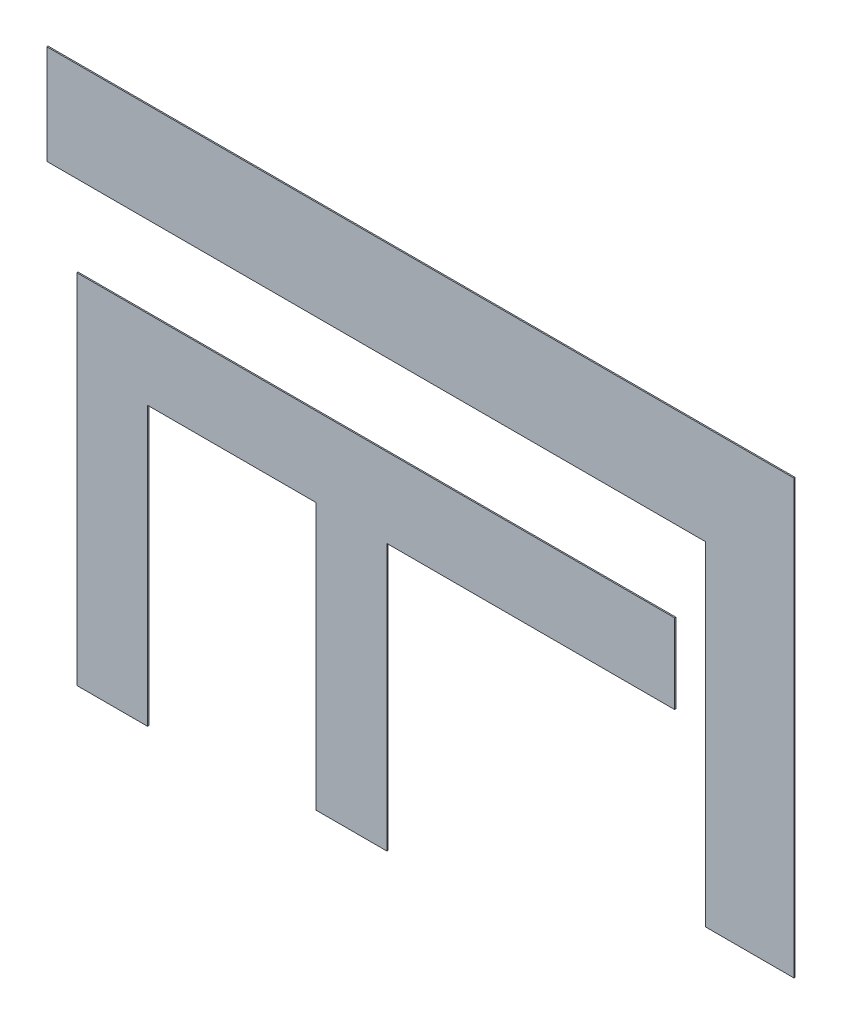
ISO-10303-21;
HEADER;
FILE_DESCRIPTION(('STEP AP214'),'2;1');
FILE_NAME('part.step','',(''),(''),'','','');
FILE_SCHEMA(('AUTOMOTIVE_DESIGN { 1 0 10303 214 1 1 1 1 }'));
ENDSEC;
DATA;
#1=APPLICATION_CONTEXT('core data for automotive mechanical design processes');
#2=APPLICATION_PROTOCOL_DEFINITION('international standard','automotive_design',2000,#1);
#3=PRODUCT_CONTEXT('',#1,'mechanical');
#4=PRODUCT('Part','Part','',(#3));
#5=PRODUCT_RELATED_PRODUCT_CATEGORY('part','',(#4));
#6=PRODUCT_DEFINITION_FORMATION('','',#4);
#7=PRODUCT_DEFINITION_CONTEXT('part definition',#1,'design');
#8=PRODUCT_DEFINITION('design','',#6,#7);
#9=PRODUCT_DEFINITION_SHAPE('','',#8);
#10=(LENGTH_UNIT() NAMED_UNIT(*) SI_UNIT(.MILLI.,.METRE.));
#11=(NAMED_UNIT(*) PLANE_ANGLE_UNIT() SI_UNIT($,.RADIAN.));
#12=(NAMED_UNIT(*) SI_UNIT($,.STERADIAN.) SOLID_ANGLE_UNIT());
#13=UNCERTAINTY_MEASURE_WITH_UNIT(LENGTH_MEASURE(1.E-05),#10,'distance_accuracy_value','');
#14=(GEOMETRIC_REPRESENTATION_CONTEXT(3) GLOBAL_UNCERTAINTY_ASSIGNED_CONTEXT((#13)) GLOBAL_UNIT_ASSIGNED_CONTEXT((#10,
#11,#12)) REPRESENTATION_CONTEXT('',''));
#15=CARTESIAN_POINT('',(0.,0.,0.));
#16=DIRECTION('',(0.,0.,1.));
#17=DIRECTION('',(1.,0.,0.));
#18=AXIS2_PLACEMENT_3D('',#15,#16,#17);
#19=CARTESIAN_POINT('',(91.640955765495,27.206571076401,-3.605521934089));
#20=DIRECTION('',(0.,-8.74227765734797E-08,0.999999999999996));
#21=DIRECTION('',(0.,-0.999999999999996,-8.74227765734797E-08));
#22=AXIS2_PLACEMENT_3D('',#19,#20,#21);
#23=PLANE('',#22);
#24=DIRECTION('',(-4.371138828674E-08,-0.999999999999999,0.));
#25=VECTOR('',#24,1.);
#26=CARTESIAN_POINT('',(91.954357595895,26.701409513994,-3.605521978252));
#27=LINE('',#26,#25);
#28=CARTESIAN_POINT('',(91.954357595895,26.7014095140236,-3.605521978252));
#29=VERTEX_POINT('',#28);
#30=CARTESIAN_POINT('',(91.954357619691,27.2458011060656,-3.605521954456));
#31=VERTEX_POINT('',#30);
#32=EDGE_CURVE('P0_E89',#29,#31,#27,.F.);
#33=ORIENTED_EDGE('',*,*,#32,.F.);
#34=DIRECTION('',(0.999999999999999,-4.37113882867396E-08,0.));
#35=VECTOR('',#34,1.);
#36=CARTESIAN_POINT('',(92.098606547719,26.7014095076016,-3.605521978252));
#37=LINE('',#36,#35);
#38=CARTESIAN_POINT('',(92.0986065477191,26.7014095076017,-3.605521957666));
#39=VERTEX_POINT('',#38);
#40=EDGE_CURVE('P0_E74',#39,#29,#37,.F.);
#41=ORIENTED_EDGE('',*,*,#40,.F.);
#42=DIRECTION('',(4.371138828674E-08,0.999999999999999,0.));
#43=VECTOR('',#42,1.);
#44=CARTESIAN_POINT('',(92.098606578598,27.40783416902,-3.605521916494));
#45=LINE('',#44,#43);
#46=CARTESIAN_POINT('',(92.098606578598,27.4078341689327,-3.605521916494));
#47=VERTEX_POINT('',#46);
#48=EDGE_CURVE('P0_E79',#47,#39,#45,.F.);
#49=ORIENTED_EDGE('',*,*,#48,.F.);
#50=DIRECTION('',(0.999999999999999,-4.37113882867396E-08,0.));
#51=VECTOR('',#50,1.);
#52=CARTESIAN_POINT('',(90.879406533728,27.4078342222256,-3.605521916494));
#53=LINE('',#52,#51);
#54=CARTESIAN_POINT('',(90.8794065337279,27.4078342222256,-3.605521923577));
#55=VERTEX_POINT('',#54);
#56=EDGE_CURVE('P0_E107',#55,#47,#53,.T.);
#57=ORIENTED_EDGE('',*,*,#56,.F.);
#58=DIRECTION('',(-4.371138828674E-08,-0.999999999999999,0.));
#59=VECTOR('',#58,1.);
#60=CARTESIAN_POINT('',(90.879406526645,27.245801153141,-3.60552193066));
#61=LINE('',#60,#59);
#62=CARTESIAN_POINT('',(90.879406526645,27.2458011531406,-3.60552193066));
#63=VERTEX_POINT('',#62);
#64=EDGE_CURVE('P0_E108',#63,#55,#61,.F.);
#65=ORIENTED_EDGE('',*,*,#64,.F.);
#66=DIRECTION('',(0.999999999999999,-4.37113882867396E-08,0.));
#67=VECTOR('',#66,1.);
#68=CARTESIAN_POINT('',(91.954357619691,27.2458011060656,-3.60552193066));
#69=LINE('',#68,#67);
#70=EDGE_CURVE('P0_E111',#31,#63,#69,.F.);
#71=ORIENTED_EDGE('',*,*,#70,.F.);
#72=EDGE_LOOP('',(#33,#41,#49,#57,#65,#71));
#73=FACE_BOUND('',#72,.T.);
#74=ADVANCED_FACE('P0_F17',(#73),#23,.T.);
#75=CARTESIAN_POINT('',(92.098606578598,27.40783416902,-3.606521916494));
#76=DIRECTION('',(0.999999999999999,-4.371138828674E-08,0.));
#77=DIRECTION('',(4.371138828674E-08,0.999999999999999,0.));
#78=AXIS2_PLACEMENT_3D('',#75,#76,#77);
#79=PLANE('',#78);
#80=DIRECTION('',(0.,-8.74227765734797E-08,0.999999999999996));
#81=VECTOR('',#80,1.);
#82=CARTESIAN_POINT('',(92.098606578598,27.4078341690201,-3.606521916494));
#83=LINE('',#82,#81);
#84=CARTESIAN_POINT('',(92.098606578598,27.4078341957538,-3.60752191649402));
#85=VERTEX_POINT('',#84);
#86=EDGE_CURVE('P0_E83',#47,#85,#83,.F.);
#87=ORIENTED_EDGE('',*,*,#86,.F.);
#88=ORIENTED_EDGE('',*,*,#48,.T.);
#89=DIRECTION('',(0.,8.74227765734797E-08,-0.999999999999996));
#90=VECTOR('',#89,1.);
#91=CARTESIAN_POINT('',(92.098606547719,26.701409507689,-3.606521978252));
#92=LINE('',#91,#90);
#93=CARTESIAN_POINT('',(92.098606568305,26.7014095077768,-3.60752197825163));
#94=VERTEX_POINT('',#93);
#95=EDGE_CURVE('P0_E81',#94,#39,#92,.F.);
#96=ORIENTED_EDGE('',*,*,#95,.F.);
#97=DIRECTION('',(0.,0.999999999999996,8.74227765734797E-08));
#98=VECTOR('',#97,1.);
#99=CARTESIAN_POINT('',(92.098606578598,27.206571076576,-3.607521934089));
#100=LINE('',#99,#98);
#101=EDGE_CURVE('P0_E129',#85,#94,#100,.F.);
#102=ORIENTED_EDGE('',*,*,#101,.F.);
#103=EDGE_LOOP('',(#87,#88,#96,#102));
#104=FACE_BOUND('',#103,.T.);
#105=ADVANCED_FACE('P0_F80',(#104),#79,.T.);
#106=CARTESIAN_POINT('',(92.098606547719,26.701409507689,-3.606521978252));
#107=DIRECTION('',(-4.37113882867398E-08,-0.999999999999995,-8.74227765734796E-08));
#108=DIRECTION('',(0.,8.74227765734797E-08,-0.999999999999996));
#109=AXIS2_PLACEMENT_3D('',#106,#107,#108);
#110=PLANE('',#109);
#111=ORIENTED_EDGE('',*,*,#95,.T.);
#112=ORIENTED_EDGE('',*,*,#40,.T.);
#113=DIRECTION('',(0.,0.,1.));
#114=VECTOR('',#113,1.);
#115=CARTESIAN_POINT('',(91.954357595895,26.701409514082,-3.606521978252));
#116=LINE('',#115,#114);
#117=CARTESIAN_POINT('',(91.954357595895,26.7014095098787,-3.60752197825163));
#118=VERTEX_POINT('',#117);
#119=EDGE_CURVE('P0_E68',#118,#29,#116,.T.);
#120=ORIENTED_EDGE('',*,*,#119,.F.);
#121=DIRECTION('',(1.,0.,0.));
#122=VECTOR('',#121,1.);
#123=CARTESIAN_POINT('',(91.640955765495,26.701409507777,-3.60752197825163));
#124=LINE('',#123,#122);
#125=EDGE_CURVE('P0_E93',#94,#118,#124,.F.);
#126=ORIENTED_EDGE('',*,*,#125,.F.);
#127=EDGE_LOOP('',(#111,#112,#120,#126));
#128=FACE_BOUND('',#127,.T.);
#129=ADVANCED_FACE('P0_F91',(#128),#110,.T.);
#130=CARTESIAN_POINT('',(91.954357595895,26.701409513994,-3.606521978252));
#131=DIRECTION('',(-0.999999999999999,4.371138828674E-08,0.));
#132=DIRECTION('',(-4.371138828674E-08,-0.999999999999999,0.));
#133=AXIS2_PLACEMENT_3D('',#130,#131,#132);
#134=PLANE('',#133);
#135=ORIENTED_EDGE('',*,*,#119,.T.);
#136=ORIENTED_EDGE('',*,*,#32,.T.);
#137=DIRECTION('',(0.,8.74227765734797E-08,-0.999999999999996));
#138=VECTOR('',#137,1.);
#139=CARTESIAN_POINT('',(91.954357619691,27.245801106153,-3.60652193066));
#140=LINE('',#139,#138);
#141=CARTESIAN_POINT('',(91.954357607793,27.2458011062401,-3.6075219306594));
#142=VERTEX_POINT('',#141);
#143=EDGE_CURVE('P0_E20',#142,#31,#140,.F.);
#144=ORIENTED_EDGE('',*,*,#143,.F.);
#145=DIRECTION('',(0.,0.999999999999996,8.74227765734797E-08));
#146=VECTOR('',#145,1.);
#147=CARTESIAN_POINT('',(91.954357595895,27.206571076576,-3.607521934089));
#148=LINE('',#147,#146);
#149=EDGE_CURVE('P0_E119',#118,#142,#148,.T.);
#150=ORIENTED_EDGE('',*,*,#149,.F.);
#151=EDGE_LOOP('',(#135,#136,#144,#150));
#152=FACE_BOUND('',#151,.T.);
#153=ADVANCED_FACE('P0_F151',(#152),#134,.T.);
#154=CARTESIAN_POINT('',(91.954357619691,27.245801106153,-3.60652193066));
#155=DIRECTION('',(-4.37113882867398E-08,-0.999999999999995,-8.74227765734796E-08));
#156=DIRECTION('',(0.,8.74227765734797E-08,-0.999999999999996));
#157=AXIS2_PLACEMENT_3D('',#154,#155,#156);
#158=PLANE('',#157);
#159=ORIENTED_EDGE('',*,*,#143,.T.);
#160=ORIENTED_EDGE('',*,*,#70,.T.);
#161=DIRECTION('',(0.,0.,1.));
#162=VECTOR('',#161,1.);
#163=CARTESIAN_POINT('',(90.879406526645,27.245801153228,-3.60652193066));
#164=LINE('',#163,#162);
#165=CARTESIAN_POINT('',(90.879406526645,27.245801129734,-3.6075219306594));
#166=VERTEX_POINT('',#165);
#167=EDGE_CURVE('P0_E109',#166,#63,#164,.T.);
#168=ORIENTED_EDGE('',*,*,#167,.F.);
#169=DIRECTION('',(1.,0.,0.));
#170=VECTOR('',#169,1.);
#171=CARTESIAN_POINT('',(91.640955765495,27.24580110624,-3.6075219306594));
#172=LINE('',#171,#170);
#173=EDGE_CURVE('P0_E118',#142,#166,#172,.F.);
#174=ORIENTED_EDGE('',*,*,#173,.F.);
#175=EDGE_LOOP('',(#159,#160,#168,#174));
#176=FACE_BOUND('',#175,.T.);
#177=ADVANCED_FACE('P0_F139',(#176),#158,.T.);
#178=CARTESIAN_POINT('',(90.879406526645,27.245801153141,-3.60652193066));
#179=DIRECTION('',(-0.999999999999999,4.371138828674E-08,0.));
#180=DIRECTION('',(-4.371138828674E-08,-0.999999999999999,0.));
#181=AXIS2_PLACEMENT_3D('',#178,#179,#180);
#182=PLANE('',#181);
#183=ORIENTED_EDGE('',*,*,#167,.T.);
#184=ORIENTED_EDGE('',*,*,#64,.T.);
#185=DIRECTION('',(0.,-8.74227765734797E-08,0.999999999999996));
#186=VECTOR('',#185,1.);
#187=CARTESIAN_POINT('',(90.879406533728,27.407834222313,-3.606521916494));
#188=LINE('',#187,#186);
#189=CARTESIAN_POINT('',(90.8794065301865,27.4078342224001,-3.60752191649402));
#190=VERTEX_POINT('',#189);
#191=EDGE_CURVE('P0_E35',#190,#55,#188,.T.);
#192=ORIENTED_EDGE('',*,*,#191,.F.);
#193=DIRECTION('',(0.,0.999999999999996,8.74227765734797E-08));
#194=VECTOR('',#193,1.);
#195=CARTESIAN_POINT('',(90.879406526645,27.206571076576,-3.607521934089));
#196=LINE('',#195,#194);
#197=EDGE_CURVE('P0_E26',#166,#190,#196,.T.);
#198=ORIENTED_EDGE('',*,*,#197,.F.);
#199=EDGE_LOOP('',(#183,#184,#192,#198));
#200=FACE_BOUND('',#199,.T.);
#201=ADVANCED_FACE('P0_F140',(#200),#182,.T.);
#202=CARTESIAN_POINT('',(90.879406533728,27.407834222313,-3.606521916494));
#203=DIRECTION('',(4.37113882867398E-08,0.999999999999995,8.74227765734796E-08));
#204=DIRECTION('',(0.,-8.74227765734797E-08,0.999999999999996));
#205=AXIS2_PLACEMENT_3D('',#202,#203,#204);
#206=PLANE('',#205);
#207=ORIENTED_EDGE('',*,*,#191,.T.);
#208=ORIENTED_EDGE('',*,*,#56,.T.);
#209=ORIENTED_EDGE('',*,*,#86,.T.);
#210=DIRECTION('',(1.,0.,0.));
#211=VECTOR('',#210,1.);
#212=CARTESIAN_POINT('',(91.640955765495,27.4078342224,-3.60752191649402));
#213=LINE('',#212,#211);
#214=EDGE_CURVE('P0_E11',#190,#85,#213,.T.);
#215=ORIENTED_EDGE('',*,*,#214,.F.);
#216=EDGE_LOOP('',(#207,#208,#209,#215));
#217=FACE_BOUND('',#216,.T.);
#218=ADVANCED_FACE('P0_F142',(#217),#206,.T.);
#219=CARTESIAN_POINT('',(91.640955765495,27.206571076576,-3.607521934089));
#220=DIRECTION('',(0.,8.74227765734797E-08,-0.999999999999996));
#221=DIRECTION('',(0.,0.999999999999996,8.74227765734797E-08));
#222=AXIS2_PLACEMENT_3D('',#219,#220,#221);
#223=PLANE('',#222);
#224=ORIENTED_EDGE('',*,*,#197,.T.);
#225=ORIENTED_EDGE('',*,*,#214,.T.);
#226=ORIENTED_EDGE('',*,*,#101,.T.);
#227=ORIENTED_EDGE('',*,*,#125,.T.);
#228=ORIENTED_EDGE('',*,*,#149,.T.);
#229=ORIENTED_EDGE('',*,*,#173,.T.);
#230=EDGE_LOOP('',(#224,#225,#226,#227,#228,#229));
#231=FACE_BOUND('',#230,.T.);
#232=ADVANCED_FACE('P0_F138',(#231),#223,.T.);
#233=CLOSED_SHELL('',(#74,#105,#129,#153,#177,#201,#218,#232));
#234=MANIFOLD_SOLID_BREP('P0_B1',#233);
#235=CARTESIAN_POINT('',(91.309690301692,26.894536980158,-3.605521961368));
#236=DIRECTION('',(0.,-8.74227765734797E-08,0.999999999999996));
#237=DIRECTION('',(0.,-0.999999999999996,-8.74227765734797E-08));
#238=AXIS2_PLACEMENT_3D('',#235,#236,#237);
#239=PLANE('',#238);
#240=DIRECTION('',(-4.371138828674E-08,-0.999999999999999,0.));
#241=VECTOR('',#240,1.);
#242=CARTESIAN_POINT('',(90.928491195511,26.529664381666,-3.605521993266));
#243=LINE('',#242,#241);
#244=CARTESIAN_POINT('',(90.928491195511,26.5296643816664,-3.605521993266));
#245=VERTEX_POINT('',#244);
#246=CARTESIAN_POINT('',(90.9284912210089,27.1129834395114,-3.60552195926933));
#247=VERTEX_POINT('',#246);
#248=EDGE_CURVE('P1_E158',#245,#247,#243,.F.);
#249=ORIENTED_EDGE('',*,*,#248,.F.);
#250=DIRECTION('',(0.999999999999999,-4.37113882867396E-08,0.));
#251=VECTOR('',#250,1.);
#252=CARTESIAN_POINT('',(91.043890358734,26.5296643765346,-3.605521993266));
#253=LINE('',#252,#251);
#254=CARTESIAN_POINT('',(91.0438903587339,26.5296643765346,-3.6055219734345));
#255=VERTEX_POINT('',#254);
#256=EDGE_CURVE('P1_E94',#255,#245,#253,.F.);
#257=ORIENTED_EDGE('',*,*,#256,.F.);
#258=DIRECTION('',(4.371138828674E-08,0.999999999999999,0.));
#259=VECTOR('',#258,1.);
#260=CARTESIAN_POINT('',(91.043890378565,26.983356977236,-3.605521953603));
#261=LINE('',#260,#259);
#262=CARTESIAN_POINT('',(91.043890378565,26.9833569771489,-3.605521953603));
#263=VERTEX_POINT('',#262);
#264=EDGE_CURVE('P1_E91',#263,#255,#261,.F.);
#265=ORIENTED_EDGE('',*,*,#264,.F.);
#266=DIRECTION('',(0.999999999999999,-4.37113882867396E-08,0.));
#267=VECTOR('',#266,1.);
#268=CARTESIAN_POINT('',(91.318951397753,26.9833569651256,-3.605521953603));
#269=LINE('',#268,#267);
#270=CARTESIAN_POINT('',(91.3189513977528,26.9833569651256,-3.6055219726055));
#271=VERTEX_POINT('',#270);
#272=EDGE_CURVE('P1_E107',#271,#263,#269,.F.);
#273=ORIENTED_EDGE('',*,*,#272,.F.);
#274=DIRECTION('',(-4.371138828674E-08,-0.999999999999999,0.));
#275=VECTOR('',#274,1.);
#276=CARTESIAN_POINT('',(91.31895137875,26.54863409006,-3.605521991608));
#277=LINE('',#276,#275);
#278=CARTESIAN_POINT('',(91.31895137875,26.5486340900599,-3.605521991608));
#279=VERTEX_POINT('',#278);
#280=EDGE_CURVE('P1_E113',#279,#271,#277,.F.);
#281=ORIENTED_EDGE('',*,*,#280,.F.);
#282=DIRECTION('',(0.999999999999999,-4.37113882867396E-08,0.));
#283=VECTOR('',#282,1.);
#284=CARTESIAN_POINT('',(91.434350541973,26.5486340849286,-3.605521991608));
#285=LINE('',#284,#283);
#286=CARTESIAN_POINT('',(91.4343505419729,26.5486340849286,-3.6055219726055));
#287=VERTEX_POINT('',#286);
#288=EDGE_CURVE('P1_E121',#287,#279,#285,.F.);
#289=ORIENTED_EDGE('',*,*,#288,.F.);
#290=DIRECTION('',(4.371138828674E-08,0.999999999999999,0.));
#291=VECTOR('',#290,1.);
#292=CARTESIAN_POINT('',(91.434350560975,26.983356960169,-3.605521953603));
#293=LINE('',#292,#291);
#294=CARTESIAN_POINT('',(91.434350560975,26.9833569601686,-3.605521953603));
#295=VERTEX_POINT('',#294);
#296=EDGE_CURVE('P1_E127',#295,#287,#293,.F.);
#297=ORIENTED_EDGE('',*,*,#296,.F.);
#298=DIRECTION('',(0.999999999999999,-4.37113882867396E-08,0.));
#299=VECTOR('',#298,1.);
#300=CARTESIAN_POINT('',(91.90385126614,26.9833569395586,-3.605521953603));
#301=LINE('',#300,#299);
#302=CARTESIAN_POINT('',(91.90385126614,26.9833569395586,-3.605521947937));
#303=VERTEX_POINT('',#302);
#304=EDGE_CURVE('P1_E133',#303,#295,#301,.F.);
#305=ORIENTED_EDGE('',*,*,#304,.F.);
#306=DIRECTION('',(4.371138828674E-08,0.999999999999999,0.));
#307=VECTOR('',#306,1.);
#308=CARTESIAN_POINT('',(91.903851271806,27.112983396964,-3.605521942271));
#309=LINE('',#308,#307);
#310=CARTESIAN_POINT('',(91.903851271806,27.1129833969937,-3.605521942271));
#311=VERTEX_POINT('',#310);
#312=EDGE_CURVE('P1_E141',#311,#303,#309,.F.);
#313=ORIENTED_EDGE('',*,*,#312,.F.);
#314=DIRECTION('',(0.999999999999999,-4.37113882867396E-08,0.));
#315=VECTOR('',#314,1.);
#316=CARTESIAN_POINT('',(90.928491221009,27.1129834395116,-3.605521942271));
#317=LINE('',#316,#315);
#318=EDGE_CURVE('P1_E148',#247,#311,#317,.T.);
#319=ORIENTED_EDGE('',*,*,#318,.F.);
#320=EDGE_LOOP('',(#249,#257,#265,#273,#281,#289,#297,#305,#313,#319));
#321=FACE_BOUND('',#320,.T.);
#322=ADVANCED_FACE('P1_F17',(#321),#239,.T.);
#323=CARTESIAN_POINT('',(91.043890378565,26.983356977236,-3.606521953603));
#324=DIRECTION('',(0.999999999999999,-4.371138828674E-08,0.));
#325=DIRECTION('',(4.371138828674E-08,0.999999999999999,0.));
#326=AXIS2_PLACEMENT_3D('',#323,#324,#325);
#327=PLANE('',#326);
#328=DIRECTION('',(0.,8.74227765734797E-08,-0.999999999999996));
#329=VECTOR('',#328,1.);
#330=CARTESIAN_POINT('',(91.043890378565,26.9833569772363,-3.606521953603));
#331=LINE('',#330,#329);
#332=CARTESIAN_POINT('',(91.043890378565,26.9833569713119,-3.60752195360311));
#333=VERTEX_POINT('',#332);
#334=EDGE_CURVE('P1_E115',#263,#333,#331,.T.);
#335=ORIENTED_EDGE('',*,*,#334,.F.);
#336=ORIENTED_EDGE('',*,*,#264,.T.);
#337=DIRECTION('',(0.,8.74227765734797E-08,-0.999999999999996));
#338=VECTOR('',#337,1.);
#339=CARTESIAN_POINT('',(91.043890358734,26.529664376622,-3.606521993266));
#340=LINE('',#339,#338);
#341=CARTESIAN_POINT('',(91.0438903686495,26.5296643767099,-3.60752199326618));
#342=VERTEX_POINT('',#341);
#343=EDGE_CURVE('P1_E20',#342,#255,#340,.F.);
#344=ORIENTED_EDGE('',*,*,#343,.F.);
#345=DIRECTION('',(0.,0.999999999999996,8.74227765734797E-08));
#346=VECTOR('',#345,1.);
#347=CARTESIAN_POINT('',(91.043890378565,26.894536980333,-3.607521961368));
#348=LINE('',#347,#346);
#349=EDGE_CURVE('P1_E89',#333,#342,#348,.F.);
#350=ORIENTED_EDGE('',*,*,#349,.F.);
#351=EDGE_LOOP('',(#335,#336,#344,#350));
#352=FACE_BOUND('',#351,.T.);
#353=ADVANCED_FACE('P1_F87',(#352),#327,.T.);
#354=CARTESIAN_POINT('',(91.043890358734,26.529664376622,-3.606521993266));
#355=DIRECTION('',(-4.37113882867398E-08,-0.999999999999995,-8.74227765734796E-08));
#356=DIRECTION('',(0.,8.74227765734797E-08,-0.999999999999996));
#357=AXIS2_PLACEMENT_3D('',#354,#355,#356);
#358=PLANE('',#357);
#359=ORIENTED_EDGE('',*,*,#343,.T.);
#360=ORIENTED_EDGE('',*,*,#256,.T.);
#361=DIRECTION('',(0.,0.,1.));
#362=VECTOR('',#361,1.);
#363=CARTESIAN_POINT('',(90.928491195511,26.529664381754,-3.606521993266));
#364=LINE('',#363,#362);
#365=CARTESIAN_POINT('',(90.928491195511,26.529664379232,-3.60752199326618));
#366=VERTEX_POINT('',#365);
#367=EDGE_CURVE('P1_E99',#366,#245,#364,.T.);
#368=ORIENTED_EDGE('',*,*,#367,.F.);
#369=DIRECTION('',(1.,0.,0.));
#370=VECTOR('',#369,1.);
#371=CARTESIAN_POINT('',(91.309690301692,26.52966437671,-3.60752199326618));
#372=LINE('',#371,#370);
#373=EDGE_CURVE('P1_E96',#342,#366,#372,.F.);
#374=ORIENTED_EDGE('',*,*,#373,.F.);
#375=EDGE_LOOP('',(#359,#360,#368,#374));
#376=FACE_BOUND('',#375,.T.);
#377=ADVANCED_FACE('P1_F97',(#376),#358,.T.);
#378=CARTESIAN_POINT('',(90.928491195511,26.529664381666,-3.606521993266));
#379=DIRECTION('',(-0.999999999999999,4.371138828674E-08,0.));
#380=DIRECTION('',(-4.371138828674E-08,-0.999999999999999,0.));
#381=AXIS2_PLACEMENT_3D('',#378,#379,#380);
#382=PLANE('',#381);
#383=ORIENTED_EDGE('',*,*,#367,.T.);
#384=ORIENTED_EDGE('',*,*,#248,.T.);
#385=DIRECTION('',(0.,-8.74227765734797E-08,0.999999999999996));
#386=VECTOR('',#385,1.);
#387=CARTESIAN_POINT('',(90.928491221009,27.112983439599,-3.606521942271));
#388=LINE('',#387,#386);
#389=CARTESIAN_POINT('',(90.9284912040103,27.1129834396861,-3.6075219422708));
#390=VERTEX_POINT('',#389);
#391=EDGE_CURVE('P1_E155',#390,#247,#388,.T.);
#392=ORIENTED_EDGE('',*,*,#391,.F.);
#393=DIRECTION('',(0.,0.999999999999996,8.74227765734797E-08));
#394=VECTOR('',#393,1.);
#395=CARTESIAN_POINT('',(90.928491195511,26.894536980333,-3.607521961368));
#396=LINE('',#395,#394);
#397=EDGE_CURVE('P1_E103',#366,#390,#396,.T.);
#398=ORIENTED_EDGE('',*,*,#397,.F.);
#399=EDGE_LOOP('',(#383,#384,#392,#398));
#400=FACE_BOUND('',#399,.T.);
#401=ADVANCED_FACE('P1_F184',(#400),#382,.T.);
#402=CARTESIAN_POINT('',(90.928491221009,27.112983439599,-3.606521942271));
#403=DIRECTION('',(4.37113882867398E-08,0.999999999999995,8.74227765734796E-08));
#404=DIRECTION('',(0.,-8.74227765734797E-08,0.999999999999996));
#405=AXIS2_PLACEMENT_3D('',#402,#403,#404);
#406=PLANE('',#405);
#407=ORIENTED_EDGE('',*,*,#391,.T.);
#408=ORIENTED_EDGE('',*,*,#318,.T.);
#409=DIRECTION('',(0.,0.,1.));
#410=VECTOR('',#409,1.);
#411=CARTESIAN_POINT('',(91.903851271806,27.112983397052,-3.606521942271));
#412=LINE('',#411,#410);
#413=CARTESIAN_POINT('',(91.903851271806,27.1129834254747,-3.6075219422708));
#414=VERTEX_POINT('',#413);
#415=EDGE_CURVE('P1_E143',#414,#311,#412,.T.);
#416=ORIENTED_EDGE('',*,*,#415,.F.);
#417=DIRECTION('',(1.,0.,0.));
#418=VECTOR('',#417,1.);
#419=CARTESIAN_POINT('',(91.309690301692,27.112983439686,-3.6075219422708));
#420=LINE('',#419,#418);
#421=EDGE_CURVE('P1_E138',#390,#414,#420,.T.);
#422=ORIENTED_EDGE('',*,*,#421,.F.);
#423=EDGE_LOOP('',(#407,#408,#416,#422));
#424=FACE_BOUND('',#423,.T.);
#425=ADVANCED_FACE('P1_F194',(#424),#406,.T.);
#426=CARTESIAN_POINT('',(91.903851271806,27.112983396964,-3.606521942271));
#427=DIRECTION('',(0.999999999999999,-4.371138828674E-08,0.));
#428=DIRECTION('',(4.371138828674E-08,0.999999999999999,0.));
#429=AXIS2_PLACEMENT_3D('',#426,#427,#428);
#430=PLANE('',#429);
#431=ORIENTED_EDGE('',*,*,#415,.T.);
#432=ORIENTED_EDGE('',*,*,#312,.T.);
#433=DIRECTION('',(0.,8.74227765734797E-08,-0.999999999999996));
#434=VECTOR('',#433,1.);
#435=CARTESIAN_POINT('',(91.90385126614,26.983356939646,-3.606521953603));
#436=LINE('',#435,#434);
#437=CARTESIAN_POINT('',(91.903851268973,26.9833569397331,-3.60752195360311));
#438=VERTEX_POINT('',#437);
#439=EDGE_CURVE('P1_E135',#438,#303,#436,.F.);
#440=ORIENTED_EDGE('',*,*,#439,.F.);
#441=DIRECTION('',(0.,0.999999999999996,8.74227765734797E-08));
#442=VECTOR('',#441,1.);
#443=CARTESIAN_POINT('',(91.903851271806,26.894536980333,-3.607521961368));
#444=LINE('',#443,#442);
#445=EDGE_CURVE('P1_E132',#414,#438,#444,.F.);
#446=ORIENTED_EDGE('',*,*,#445,.F.);
#447=EDGE_LOOP('',(#431,#432,#440,#446));
#448=FACE_BOUND('',#447,.T.);
#449=ADVANCED_FACE('P1_F200',(#448),#430,.T.);
#450=CARTESIAN_POINT('',(91.90385126614,26.983356939646,-3.606521953603));
#451=DIRECTION('',(-4.37113882867398E-08,-0.999999999999995,-8.74227765734796E-08));
#452=DIRECTION('',(0.,8.74227765734797E-08,-0.999999999999996));
#453=AXIS2_PLACEMENT_3D('',#450,#451,#452);
#454=PLANE('',#453);
#455=ORIENTED_EDGE('',*,*,#439,.T.);
#456=ORIENTED_EDGE('',*,*,#304,.T.);
#457=DIRECTION('',(0.,0.,1.));
#458=VECTOR('',#457,1.);
#459=CARTESIAN_POINT('',(91.434350560975,26.983356960256,-3.606521953603));
#460=LINE('',#459,#458);
#461=CARTESIAN_POINT('',(91.434350560975,26.9833569499945,-3.60752195360311));
#462=VERTEX_POINT('',#461);
#463=EDGE_CURVE('P1_E129',#462,#295,#460,.T.);
#464=ORIENTED_EDGE('',*,*,#463,.F.);
#465=DIRECTION('',(1.,0.,0.));
#466=VECTOR('',#465,1.);
#467=CARTESIAN_POINT('',(91.309690301692,26.983356939733,-3.60752195360311));
#468=LINE('',#467,#466);
#469=EDGE_CURVE('P1_E126',#438,#462,#468,.F.);
#470=ORIENTED_EDGE('',*,*,#469,.F.);
#471=EDGE_LOOP('',(#455,#456,#464,#470));
#472=FACE_BOUND('',#471,.T.);
#473=ADVANCED_FACE('P1_F204',(#472),#454,.T.);
#474=CARTESIAN_POINT('',(91.434350560975,26.983356960169,-3.606521953603));
#475=DIRECTION('',(0.999999999999999,-4.371138828674E-08,0.));
#476=DIRECTION('',(4.371138828674E-08,0.999999999999999,0.));
#477=AXIS2_PLACEMENT_3D('',#474,#475,#476);
#478=PLANE('',#477);
#479=ORIENTED_EDGE('',*,*,#463,.T.);
#480=ORIENTED_EDGE('',*,*,#296,.T.);
#481=DIRECTION('',(0.,8.74227765734797E-08,-0.999999999999996));
#482=VECTOR('',#481,1.);
#483=CARTESIAN_POINT('',(91.434350541973,26.548634085016,-3.606521991608));
#484=LINE('',#483,#482);
#485=CARTESIAN_POINT('',(91.434350551474,26.5486340851031,-3.60752199160779));
#486=VERTEX_POINT('',#485);
#487=EDGE_CURVE('P1_E123',#486,#287,#484,.F.);
#488=ORIENTED_EDGE('',*,*,#487,.F.);
#489=DIRECTION('',(0.,0.999999999999996,8.74227765734797E-08));
#490=VECTOR('',#489,1.);
#491=CARTESIAN_POINT('',(91.434350560975,26.894536980333,-3.607521961368));
#492=LINE('',#491,#490);
#493=EDGE_CURVE('P1_E120',#462,#486,#492,.F.);
#494=ORIENTED_EDGE('',*,*,#493,.F.);
#495=EDGE_LOOP('',(#479,#480,#488,#494));
#496=FACE_BOUND('',#495,.T.);
#497=ADVANCED_FACE('P1_F206',(#496),#478,.T.);
#498=CARTESIAN_POINT('',(91.434350541973,26.548634085016,-3.606521991608));
#499=DIRECTION('',(-4.37113882867398E-08,-0.999999999999995,-8.74227765734796E-08));
#500=DIRECTION('',(0.,8.74227765734797E-08,-0.999999999999996));
#501=AXIS2_PLACEMENT_3D('',#498,#499,#500);
#502=PLANE('',#501);
#503=ORIENTED_EDGE('',*,*,#487,.T.);
#504=ORIENTED_EDGE('',*,*,#288,.T.);
#505=DIRECTION('',(0.,0.,1.));
#506=VECTOR('',#505,1.);
#507=CARTESIAN_POINT('',(91.31895137875,26.548634090147,-3.606521991608));
#508=LINE('',#507,#506);
#509=CARTESIAN_POINT('',(91.31895137875,26.548634087625,-3.60752199160779));
#510=VERTEX_POINT('',#509);
#511=EDGE_CURVE('P1_E116',#510,#279,#508,.T.);
#512=ORIENTED_EDGE('',*,*,#511,.F.);
#513=DIRECTION('',(1.,0.,0.));
#514=VECTOR('',#513,1.);
#515=CARTESIAN_POINT('',(91.309690301692,26.548634085103,-3.60752199160779));
#516=LINE('',#515,#514);
#517=EDGE_CURVE('P1_E117',#486,#510,#516,.F.);
#518=ORIENTED_EDGE('',*,*,#517,.F.);
#519=EDGE_LOOP('',(#503,#504,#512,#518));
#520=FACE_BOUND('',#519,.T.);
#521=ADVANCED_FACE('P1_F210',(#520),#502,.T.);
#522=CARTESIAN_POINT('',(91.31895137875,26.54863409006,-3.606521991608));
#523=DIRECTION('',(-0.999999999999999,4.371138828674E-08,0.));
#524=DIRECTION('',(-4.371138828674E-08,-0.999999999999999,0.));
#525=AXIS2_PLACEMENT_3D('',#522,#523,#524);
#526=PLANE('',#525);
#527=ORIENTED_EDGE('',*,*,#511,.T.);
#528=ORIENTED_EDGE('',*,*,#280,.T.);
#529=DIRECTION('',(0.,8.74227765734797E-08,-0.999999999999996));
#530=VECTOR('',#529,1.);
#531=CARTESIAN_POINT('',(91.318951397753,26.983356965213,-3.606521953603));
#532=LINE('',#531,#530);
#533=CARTESIAN_POINT('',(91.3189513882515,26.9833569653001,-3.60752195360311));
#534=VERTEX_POINT('',#533);
#535=EDGE_CURVE('P1_E35',#534,#271,#532,.F.);
#536=ORIENTED_EDGE('',*,*,#535,.F.);
#537=DIRECTION('',(0.,0.999999999999996,8.74227765734797E-08));
#538=VECTOR('',#537,1.);
#539=CARTESIAN_POINT('',(91.31895137875,26.894536980333,-3.607521961368));
#540=LINE('',#539,#538);
#541=EDGE_CURVE('P1_E26',#510,#534,#540,.T.);
#542=ORIENTED_EDGE('',*,*,#541,.F.);
#543=EDGE_LOOP('',(#527,#528,#536,#542));
#544=FACE_BOUND('',#543,.T.);
#545=ADVANCED_FACE('P1_F211',(#544),#526,.T.);
#546=CARTESIAN_POINT('',(91.318951397753,26.983356965213,-3.606521953603));
#547=DIRECTION('',(-4.37113882867398E-08,-0.999999999999995,-8.74227765734796E-08));
#548=DIRECTION('',(0.,8.74227765734797E-08,-0.999999999999996));
#549=AXIS2_PLACEMENT_3D('',#546,#547,#548);
#550=PLANE('',#549);
#551=ORIENTED_EDGE('',*,*,#535,.T.);
#552=ORIENTED_EDGE('',*,*,#272,.T.);
#553=ORIENTED_EDGE('',*,*,#334,.T.);
#554=DIRECTION('',(1.,0.,0.));
#555=VECTOR('',#554,1.);
#556=CARTESIAN_POINT('',(91.309690301692,26.9833569653,-3.60752195360311));
#557=LINE('',#556,#555);
#558=EDGE_CURVE('P1_E11',#534,#333,#557,.F.);
#559=ORIENTED_EDGE('',*,*,#558,.F.);
#560=EDGE_LOOP('',(#551,#552,#553,#559));
#561=FACE_BOUND('',#560,.T.);
#562=ADVANCED_FACE('P1_F215',(#561),#550,.T.);
#563=CARTESIAN_POINT('',(91.309690301692,26.894536980333,-3.607521961368));
#564=DIRECTION('',(0.,8.74227765734797E-08,-0.999999999999996));
#565=DIRECTION('',(0.,0.999999999999996,8.74227765734797E-08));
#566=AXIS2_PLACEMENT_3D('',#563,#564,#565);
#567=PLANE('',#566);
#568=ORIENTED_EDGE('',*,*,#541,.T.);
#569=ORIENTED_EDGE('',*,*,#558,.T.);
#570=ORIENTED_EDGE('',*,*,#349,.T.);
#571=ORIENTED_EDGE('',*,*,#373,.T.);
#572=ORIENTED_EDGE('',*,*,#397,.T.);
#573=ORIENTED_EDGE('',*,*,#421,.T.);
#574=ORIENTED_EDGE('',*,*,#445,.T.);
#575=ORIENTED_EDGE('',*,*,#469,.T.);
#576=ORIENTED_EDGE('',*,*,#493,.T.);
#577=ORIENTED_EDGE('',*,*,#517,.T.);
#578=EDGE_LOOP('',(#568,#569,#570,#571,#572,#573,#574,#575,#576,#577));
#579=FACE_BOUND('',#578,.T.);
#580=ADVANCED_FACE('P1_F106',(#579),#567,.T.);
#581=CLOSED_SHELL('',(#322,#353,#377,#401,#425,#449,#473,#497,#521,#545,#562,#580));
#582=MANIFOLD_SOLID_BREP('P1_B1',#581);
#583=ADVANCED_BREP_SHAPE_REPRESENTATION('',(#18,#234,#582),#14);
#584=SHAPE_DEFINITION_REPRESENTATION(#9,#583);
ENDSEC;
END-ISO-10303-21;
